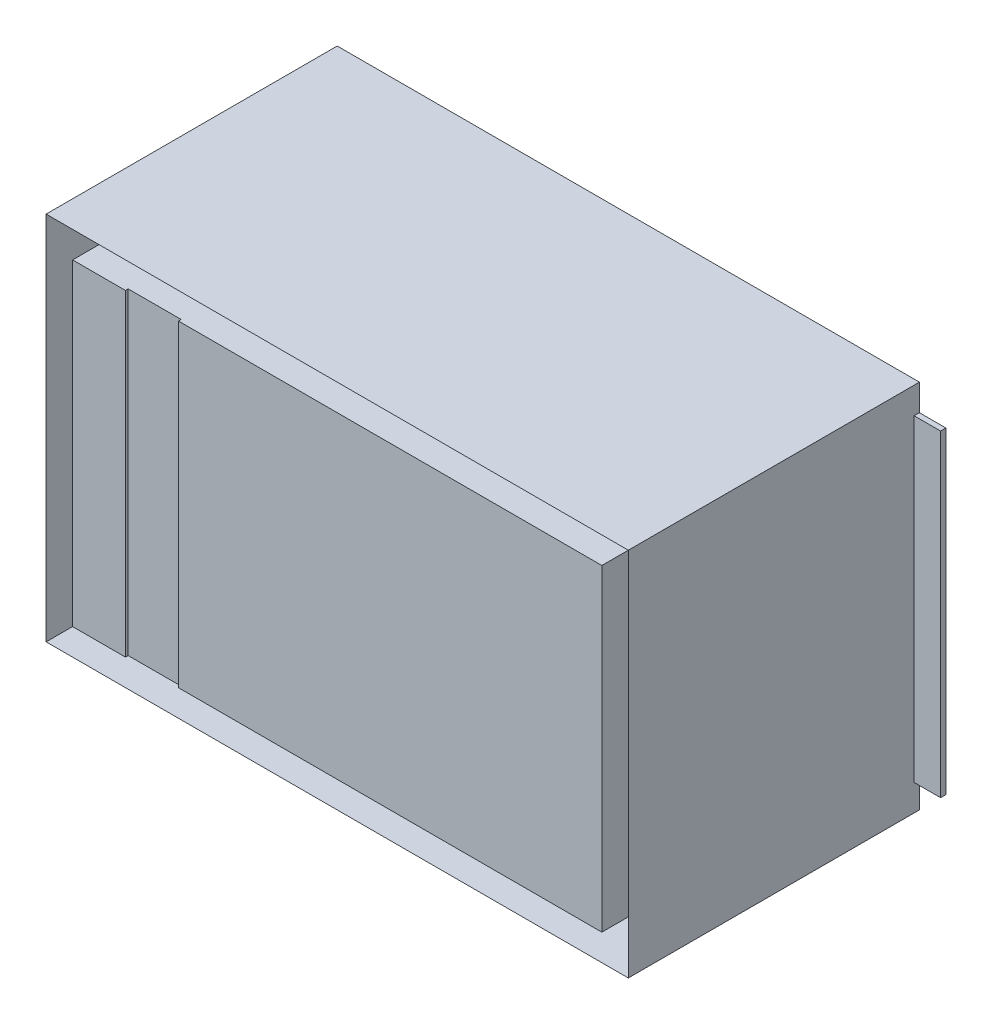
ISO-10303-21;
HEADER;
FILE_DESCRIPTION(('STEP AP214'),'2;1');
FILE_NAME('part.step','',(''),(''),'','','');
FILE_SCHEMA(('AUTOMOTIVE_DESIGN { 1 0 10303 214 1 1 1 1 }'));
ENDSEC;
DATA;
#1=APPLICATION_CONTEXT('core data for automotive mechanical design processes');
#2=APPLICATION_PROTOCOL_DEFINITION('international standard','automotive_design',2000,#1);
#3=PRODUCT_CONTEXT('',#1,'mechanical');
#4=PRODUCT('Part','Part','',(#3));
#5=PRODUCT_RELATED_PRODUCT_CATEGORY('part','',(#4));
#6=PRODUCT_DEFINITION_FORMATION('','',#4);
#7=PRODUCT_DEFINITION_CONTEXT('part definition',#1,'design');
#8=PRODUCT_DEFINITION('design','',#6,#7);
#9=PRODUCT_DEFINITION_SHAPE('','',#8);
#10=(LENGTH_UNIT() NAMED_UNIT(*) SI_UNIT(.MILLI.,.METRE.));
#11=(NAMED_UNIT(*) PLANE_ANGLE_UNIT() SI_UNIT($,.RADIAN.));
#12=(NAMED_UNIT(*) SI_UNIT($,.STERADIAN.) SOLID_ANGLE_UNIT());
#13=UNCERTAINTY_MEASURE_WITH_UNIT(LENGTH_MEASURE(1.E-05),#10,'distance_accuracy_value','');
#14=(GEOMETRIC_REPRESENTATION_CONTEXT(3) GLOBAL_UNCERTAINTY_ASSIGNED_CONTEXT((#13)) GLOBAL_UNIT_ASSIGNED_CONTEXT((#10,
#11,#12)) REPRESENTATION_CONTEXT('',''));
#15=CARTESIAN_POINT('',(0.,0.,0.));
#16=DIRECTION('',(0.,0.,1.));
#17=DIRECTION('',(1.,0.,0.));
#18=AXIS2_PLACEMENT_3D('',#15,#16,#17);
#19=CARTESIAN_POINT('',(0.5,-0.3,0.0762));
#20=DIRECTION('',(1.,0.,0.));
#21=DIRECTION('',(0.,1.,0.));
#22=AXIS2_PLACEMENT_3D('',#19,#20,#21);
#23=PLANE('',#22);
#24=DIRECTION('',(0.,0.,1.));
#25=VECTOR('',#24,1.);
#26=CARTESIAN_POINT('',(0.5,0.3,0.1262));
#27=LINE('',#26,#25);
#28=CARTESIAN_POINT('',(0.5,0.3,0.1262));
#29=VERTEX_POINT('',#28);
#30=CARTESIAN_POINT('',(0.5,0.3,0.6262));
#31=VERTEX_POINT('',#30);
#32=EDGE_CURVE('P0_E222',#29,#31,#27,.T.);
#33=ORIENTED_EDGE('',*,*,#32,.T.);
#34=DIRECTION('',(0.,1.,0.));
#35=VECTOR('',#34,1.);
#36=CARTESIAN_POINT('',(0.5,-0.3,0.6262));
#37=LINE('',#36,#35);
#38=CARTESIAN_POINT('',(0.5,-0.3,0.6262));
#39=VERTEX_POINT('',#38);
#40=EDGE_CURVE('P0_E11',#39,#31,#37,.T.);
#41=ORIENTED_EDGE('',*,*,#40,.F.);
#42=DIRECTION('',(0.,0.,1.));
#43=VECTOR('',#42,1.);
#44=CARTESIAN_POINT('',(0.5,-0.3,0.1262));
#45=LINE('',#44,#43);
#46=CARTESIAN_POINT('',(0.5,-0.3,0.1262));
#47=VERTEX_POINT('',#46);
#48=EDGE_CURVE('P0_E445',#47,#39,#45,.T.);
#49=ORIENTED_EDGE('',*,*,#48,.F.);
#50=DIRECTION('',(0.,1.,0.));
#51=VECTOR('',#50,1.);
#52=CARTESIAN_POINT('',(0.5,-0.3,0.1262));
#53=LINE('',#52,#51);
#54=EDGE_CURVE('P0_E225',#47,#29,#53,.T.);
#55=ORIENTED_EDGE('',*,*,#54,.T.);
#56=EDGE_LOOP('',(#33,#41,#49,#55));
#57=FACE_BOUND('',#56,.T.);
#58=ADVANCED_FACE('P0_F18',(#57),#23,.T.);
#59=CARTESIAN_POINT('',(-0.4,0.3,0.6262));
#60=DIRECTION('',(-1.,0.,0.));
#61=DIRECTION('',(0.,0.,1.));
#62=AXIS2_PLACEMENT_3D('',#59,#60,#61);
#63=PLANE('',#62);
#64=DIRECTION('',(0.,0.,-1.));
#65=VECTOR('',#64,1.);
#66=CARTESIAN_POINT('',(-0.4,-0.3,0.6262));
#67=LINE('',#66,#65);
#68=CARTESIAN_POINT('',(-0.4,-0.3,0.6262));
#69=VERTEX_POINT('',#68);
#70=CARTESIAN_POINT('',(-0.4,-0.3,0.6211));
#71=VERTEX_POINT('',#70);
#72=EDGE_CURVE('P0_E446',#69,#71,#67,.T.);
#73=ORIENTED_EDGE('',*,*,#72,.T.);
#74=DIRECTION('',(0.,-1.,0.));
#75=VECTOR('',#74,1.);
#76=CARTESIAN_POINT('',(-0.4,0.3,0.6211));
#77=LINE('',#76,#75);
#78=CARTESIAN_POINT('',(-0.4,0.3,0.6211));
#79=VERTEX_POINT('',#78);
#80=EDGE_CURVE('P0_E342',#79,#71,#77,.T.);
#81=ORIENTED_EDGE('',*,*,#80,.F.);
#82=DIRECTION('',(0.,0.,-1.));
#83=VECTOR('',#82,1.);
#84=CARTESIAN_POINT('',(-0.4,0.3,0.6262));
#85=LINE('',#84,#83);
#86=CARTESIAN_POINT('',(-0.4,0.3,0.6262));
#87=VERTEX_POINT('',#86);
#88=EDGE_CURVE('P0_E287',#87,#79,#85,.T.);
#89=ORIENTED_EDGE('',*,*,#88,.F.);
#90=DIRECTION('',(0.,1.,0.));
#91=VECTOR('',#90,1.);
#92=CARTESIAN_POINT('',(-0.4,-0.3,0.6262));
#93=LINE('',#92,#91);
#94=EDGE_CURVE('P0_E29',#69,#87,#93,.T.);
#95=ORIENTED_EDGE('',*,*,#94,.F.);
#96=EDGE_LOOP('',(#73,#81,#89,#95));
#97=FACE_BOUND('',#96,.T.);
#98=ADVANCED_FACE('P0_F1097',(#97),#63,.F.);
#99=CARTESIAN_POINT('',(0.,0.,0.6262));
#100=DIRECTION('',(0.,0.,1.));
#101=DIRECTION('',(1.,0.,0.));
#102=AXIS2_PLACEMENT_3D('',#99,#100,#101);
#103=PLANE('',#102);
#104=DIRECTION('',(1.,0.,0.));
#105=VECTOR('',#104,1.);
#106=CARTESIAN_POINT('',(-0.3,-0.3,0.6262));
#107=LINE('',#106,#105);
#108=CARTESIAN_POINT('',(-0.3,-0.3,0.6262));
#109=VERTEX_POINT('',#108);
#110=EDGE_CURVE('P0_E241',#109,#39,#107,.T.);
#111=ORIENTED_EDGE('',*,*,#110,.T.);
#112=ORIENTED_EDGE('',*,*,#40,.T.);
#113=DIRECTION('',(-1.,0.,0.));
#114=VECTOR('',#113,1.);
#115=CARTESIAN_POINT('',(0.5,0.3,0.6262));
#116=LINE('',#115,#114);
#117=CARTESIAN_POINT('',(-0.3,0.3,0.6262));
#118=VERTEX_POINT('',#117);
#119=EDGE_CURVE('P0_E422',#31,#118,#116,.T.);
#120=ORIENTED_EDGE('',*,*,#119,.T.);
#121=DIRECTION('',(0.,1.,0.));
#122=VECTOR('',#121,1.);
#123=CARTESIAN_POINT('',(-0.3,-0.3,0.6262));
#124=LINE('',#123,#122);
#125=EDGE_CURVE('P0_E43',#109,#118,#124,.T.);
#126=ORIENTED_EDGE('',*,*,#125,.F.);
#127=EDGE_LOOP('',(#111,#112,#120,#126));
#128=FACE_BOUND('',#127,.T.);
#129=ADVANCED_FACE('P0_F1120',(#128),#103,.T.);
#130=CARTESIAN_POINT('',(0.,0.,0.6262));
#131=DIRECTION('',(0.,0.,1.));
#132=DIRECTION('',(1.,0.,0.));
#133=AXIS2_PLACEMENT_3D('',#130,#131,#132);
#134=PLANE('',#133);
#135=DIRECTION('',(-1.,0.,0.));
#136=VECTOR('',#135,1.);
#137=CARTESIAN_POINT('',(-0.4,0.3,0.6262));
#138=LINE('',#137,#136);
#139=CARTESIAN_POINT('',(-0.5,0.3,0.6262));
#140=VERTEX_POINT('',#139);
#141=EDGE_CURVE('P0_E335',#87,#140,#138,.T.);
#142=ORIENTED_EDGE('',*,*,#141,.T.);
#143=DIRECTION('',(0.,-1.,0.));
#144=VECTOR('',#143,1.);
#145=CARTESIAN_POINT('',(-0.5,0.3,0.6262));
#146=LINE('',#145,#144);
#147=CARTESIAN_POINT('',(-0.5,-0.3,0.6262));
#148=VERTEX_POINT('',#147);
#149=EDGE_CURVE('P0_E202',#140,#148,#146,.T.);
#150=ORIENTED_EDGE('',*,*,#149,.T.);
#151=DIRECTION('',(1.,0.,0.));
#152=VECTOR('',#151,1.);
#153=CARTESIAN_POINT('',(-0.5,-0.3,0.6262));
#154=LINE('',#153,#152);
#155=EDGE_CURVE('P0_E441',#148,#69,#154,.T.);
#156=ORIENTED_EDGE('',*,*,#155,.T.);
#157=ORIENTED_EDGE('',*,*,#94,.T.);
#158=EDGE_LOOP('',(#142,#150,#156,#157));
#159=FACE_BOUND('',#158,.T.);
#160=ADVANCED_FACE('P0_F1116',(#159),#134,.T.);
#161=CARTESIAN_POINT('',(-0.3,-0.3,0.6262));
#162=DIRECTION('',(1.,0.,0.));
#163=DIRECTION('',(0.,1.,0.));
#164=AXIS2_PLACEMENT_3D('',#161,#162,#163);
#165=PLANE('',#164);
#166=DIRECTION('',(0.,0.,-1.));
#167=VECTOR('',#166,1.);
#168=CARTESIAN_POINT('',(-0.3,0.3,0.6262));
#169=LINE('',#168,#167);
#170=CARTESIAN_POINT('',(-0.3,0.3,0.6211));
#171=VERTEX_POINT('',#170);
#172=EDGE_CURVE('P0_E207',#118,#171,#169,.T.);
#173=ORIENTED_EDGE('',*,*,#172,.T.);
#174=DIRECTION('',(0.,1.,0.));
#175=VECTOR('',#174,1.);
#176=CARTESIAN_POINT('',(-0.3,-0.3,0.6211));
#177=LINE('',#176,#175);
#178=CARTESIAN_POINT('',(-0.3,-0.3,0.6211));
#179=VERTEX_POINT('',#178);
#180=EDGE_CURVE('P0_E286',#179,#171,#177,.T.);
#181=ORIENTED_EDGE('',*,*,#180,.F.);
#182=DIRECTION('',(0.,0.,-1.));
#183=VECTOR('',#182,1.);
#184=CARTESIAN_POINT('',(-0.3,-0.3,0.6262));
#185=LINE('',#184,#183);
#186=EDGE_CURVE('P0_E415',#109,#179,#185,.T.);
#187=ORIENTED_EDGE('',*,*,#186,.F.);
#188=ORIENTED_EDGE('',*,*,#125,.T.);
#189=EDGE_LOOP('',(#173,#181,#187,#188));
#190=FACE_BOUND('',#189,.T.);
#191=ADVANCED_FACE('P0_F1075',(#190),#165,.F.);
#192=CARTESIAN_POINT('',(-0.5,-0.3,0.0762));
#193=DIRECTION('',(0.,-1.,0.));
#194=DIRECTION('',(0.,0.,-1.));
#195=AXIS2_PLACEMENT_3D('',#192,#193,#194);
#196=PLANE('',#195);
#197=ORIENTED_EDGE('',*,*,#72,.F.);
#198=ORIENTED_EDGE('',*,*,#155,.F.);
#199=DIRECTION('',(0.,0.,1.));
#200=VECTOR('',#199,1.);
#201=CARTESIAN_POINT('',(-0.5,-0.3,0.1262));
#202=LINE('',#201,#200);
#203=CARTESIAN_POINT('',(-0.5,-0.3,0.1262));
#204=VERTEX_POINT('',#203);
#205=EDGE_CURVE('P0_E348',#204,#148,#202,.T.);
#206=ORIENTED_EDGE('',*,*,#205,.F.);
#207=DIRECTION('',(1.,0.,0.));
#208=VECTOR('',#207,1.);
#209=CARTESIAN_POINT('',(-0.5,-0.3,0.1262));
#210=LINE('',#209,#208);
#211=EDGE_CURVE('P0_E215',#204,#47,#210,.T.);
#212=ORIENTED_EDGE('',*,*,#211,.T.);
#213=ORIENTED_EDGE('',*,*,#48,.T.);
#214=ORIENTED_EDGE('',*,*,#110,.F.);
#215=ORIENTED_EDGE('',*,*,#186,.T.);
#216=DIRECTION('',(1.,0.,0.));
#217=VECTOR('',#216,1.);
#218=CARTESIAN_POINT('',(-0.4,-0.3,0.6211));
#219=LINE('',#218,#217);
#220=EDGE_CURVE('P0_E450',#71,#179,#219,.T.);
#221=ORIENTED_EDGE('',*,*,#220,.F.);
#222=EDGE_LOOP('',(#197,#198,#206,#212,#213,#214,#215,#221));
#223=FACE_BOUND('',#222,.T.);
#224=ADVANCED_FACE('P0_F1069',(#223),#196,.T.);
#225=CARTESIAN_POINT('',(0.,0.,0.6211));
#226=DIRECTION('',(0.,0.,1.));
#227=DIRECTION('',(1.,0.,0.));
#228=AXIS2_PLACEMENT_3D('',#225,#226,#227);
#229=PLANE('',#228);
#230=ORIENTED_EDGE('',*,*,#180,.T.);
#231=DIRECTION('',(1.,0.,0.));
#232=VECTOR('',#231,1.);
#233=CARTESIAN_POINT('',(-0.4,0.3,0.6211));
#234=LINE('',#233,#232);
#235=EDGE_CURVE('P0_E282',#79,#171,#234,.T.);
#236=ORIENTED_EDGE('',*,*,#235,.F.);
#237=ORIENTED_EDGE('',*,*,#80,.T.);
#238=ORIENTED_EDGE('',*,*,#220,.T.);
#239=EDGE_LOOP('',(#230,#236,#237,#238));
#240=FACE_BOUND('',#239,.T.);
#241=ADVANCED_FACE('P0_F1074',(#240),#229,.T.);
#242=CARTESIAN_POINT('',(0.5,0.3,0.0762));
#243=DIRECTION('',(0.,1.,0.));
#244=DIRECTION('',(1.,0.,0.));
#245=AXIS2_PLACEMENT_3D('',#242,#243,#244);
#246=PLANE('',#245);
#247=ORIENTED_EDGE('',*,*,#172,.F.);
#248=ORIENTED_EDGE('',*,*,#119,.F.);
#249=ORIENTED_EDGE('',*,*,#32,.F.);
#250=DIRECTION('',(-1.,0.,0.));
#251=VECTOR('',#250,1.);
#252=CARTESIAN_POINT('',(0.5,0.3,0.1262));
#253=LINE('',#252,#251);
#254=CARTESIAN_POINT('',(-0.5,0.3,0.1262));
#255=VERTEX_POINT('',#254);
#256=EDGE_CURVE('P0_E213',#29,#255,#253,.T.);
#257=ORIENTED_EDGE('',*,*,#256,.T.);
#258=DIRECTION('',(0.,0.,1.));
#259=VECTOR('',#258,1.);
#260=CARTESIAN_POINT('',(-0.5,0.3,0.1262));
#261=LINE('',#260,#259);
#262=EDGE_CURVE('P0_E195',#255,#140,#261,.T.);
#263=ORIENTED_EDGE('',*,*,#262,.T.);
#264=ORIENTED_EDGE('',*,*,#141,.F.);
#265=ORIENTED_EDGE('',*,*,#88,.T.);
#266=ORIENTED_EDGE('',*,*,#235,.T.);
#267=EDGE_LOOP('',(#247,#248,#249,#257,#263,#264,#265,#266));
#268=FACE_BOUND('',#267,.T.);
#269=ADVANCED_FACE('P0_F20',(#268),#246,.T.);
#270=CARTESIAN_POINT('',(-0.5,0.3,0.0762));
#271=DIRECTION('',(-1.,0.,0.));
#272=DIRECTION('',(0.,0.,1.));
#273=AXIS2_PLACEMENT_3D('',#270,#271,#272);
#274=PLANE('',#273);
#275=ORIENTED_EDGE('',*,*,#205,.T.);
#276=ORIENTED_EDGE('',*,*,#149,.F.);
#277=ORIENTED_EDGE('',*,*,#262,.F.);
#278=DIRECTION('',(0.,-1.,0.));
#279=VECTOR('',#278,1.);
#280=CARTESIAN_POINT('',(-0.5,0.3,0.1262));
#281=LINE('',#280,#279);
#282=EDGE_CURVE('P0_E199',#255,#204,#281,.T.);
#283=ORIENTED_EDGE('',*,*,#282,.T.);
#284=EDGE_LOOP('',(#275,#276,#277,#283));
#285=FACE_BOUND('',#284,.T.);
#286=ADVANCED_FACE('P0_F198',(#285),#274,.T.);
#287=CARTESIAN_POINT('',(-0.45,-0.25,0.0762));
#288=DIRECTION('',(1.,0.,0.));
#289=DIRECTION('',(0.,1.,0.));
#290=AXIS2_PLACEMENT_3D('',#287,#288,#289);
#291=PLANE('',#290);
#292=DIRECTION('',(0.,0.,1.));
#293=VECTOR('',#292,1.);
#294=CARTESIAN_POINT('',(-0.45,-0.25,0.0862));
#295=LINE('',#294,#293);
#296=CARTESIAN_POINT('',(-0.45,-0.25,0.0862));
#297=VERTEX_POINT('',#296);
#298=CARTESIAN_POINT('',(-0.45,-0.25,0.1262));
#299=VERTEX_POINT('',#298);
#300=EDGE_CURVE('P0_E346',#297,#299,#295,.T.);
#301=ORIENTED_EDGE('',*,*,#300,.T.);
#302=DIRECTION('',(0.,1.,0.));
#303=VECTOR('',#302,1.);
#304=CARTESIAN_POINT('',(-0.45,-0.25,0.1262));
#305=LINE('',#304,#303);
#306=CARTESIAN_POINT('',(-0.45,0.25,0.1262));
#307=VERTEX_POINT('',#306);
#308=EDGE_CURVE('P0_E217',#299,#307,#305,.T.);
#309=ORIENTED_EDGE('',*,*,#308,.T.);
#310=DIRECTION('',(0.,0.,1.));
#311=VECTOR('',#310,1.);
#312=CARTESIAN_POINT('',(-0.45,0.25,0.0862));
#313=LINE('',#312,#311);
#314=CARTESIAN_POINT('',(-0.45,0.25,0.0862));
#315=VERTEX_POINT('',#314);
#316=EDGE_CURVE('P0_E301',#315,#307,#313,.T.);
#317=ORIENTED_EDGE('',*,*,#316,.F.);
#318=DIRECTION('',(0.,1.,0.));
#319=VECTOR('',#318,1.);
#320=CARTESIAN_POINT('',(-0.45,-0.25,0.0862));
#321=LINE('',#320,#319);
#322=EDGE_CURVE('P0_E275',#297,#315,#321,.T.);
#323=ORIENTED_EDGE('',*,*,#322,.F.);
#324=EDGE_LOOP('',(#301,#309,#317,#323));
#325=FACE_BOUND('',#324,.T.);
#326=ADVANCED_FACE('P0_F1159',(#325),#291,.F.);
#327=CARTESIAN_POINT('',(-0.2,-0.25,0.0762));
#328=DIRECTION('',(0.,1.,0.));
#329=DIRECTION('',(1.,0.,0.));
#330=AXIS2_PLACEMENT_3D('',#327,#328,#329);
#331=PLANE('',#330);
#332=DIRECTION('',(0.,0.,1.));
#333=VECTOR('',#332,1.);
#334=CARTESIAN_POINT('',(-0.2,-0.25,0.0862));
#335=LINE('',#334,#333);
#336=CARTESIAN_POINT('',(-0.2,-0.25,0.0862));
#337=VERTEX_POINT('',#336);
#338=CARTESIAN_POINT('',(-0.2,-0.25,0.1262));
#339=VERTEX_POINT('',#338);
#340=EDGE_CURVE('P0_E349',#337,#339,#335,.T.);
#341=ORIENTED_EDGE('',*,*,#340,.T.);
#342=DIRECTION('',(-1.,0.,0.));
#343=VECTOR('',#342,1.);
#344=CARTESIAN_POINT('',(-0.2,-0.25,0.1262));
#345=LINE('',#344,#343);
#346=EDGE_CURVE('P0_E262',#339,#299,#345,.T.);
#347=ORIENTED_EDGE('',*,*,#346,.T.);
#348=ORIENTED_EDGE('',*,*,#300,.F.);
#349=DIRECTION('',(-1.,0.,0.));
#350=VECTOR('',#349,1.);
#351=CARTESIAN_POINT('',(-0.2,-0.25,0.0862));
#352=LINE('',#351,#350);
#353=EDGE_CURVE('P0_E292',#337,#297,#352,.T.);
#354=ORIENTED_EDGE('',*,*,#353,.F.);
#355=EDGE_LOOP('',(#341,#347,#348,#354));
#356=FACE_BOUND('',#355,.T.);
#357=ADVANCED_FACE('P0_F510',(#356),#331,.F.);
#358=CARTESIAN_POINT('',(-0.2,0.25,0.0762));
#359=DIRECTION('',(-1.,0.,0.));
#360=DIRECTION('',(0.,0.,1.));
#361=AXIS2_PLACEMENT_3D('',#358,#359,#360);
#362=PLANE('',#361);
#363=DIRECTION('',(0.,0.,1.));
#364=VECTOR('',#363,1.);
#365=CARTESIAN_POINT('',(-0.2,0.25,0.0862));
#366=LINE('',#365,#364);
#367=CARTESIAN_POINT('',(-0.2,0.25,0.0862));
#368=VERTEX_POINT('',#367);
#369=CARTESIAN_POINT('',(-0.2,0.25,0.1262));
#370=VERTEX_POINT('',#369);
#371=EDGE_CURVE('P0_E437',#368,#370,#366,.T.);
#372=ORIENTED_EDGE('',*,*,#371,.T.);
#373=DIRECTION('',(0.,-1.,0.));
#374=VECTOR('',#373,1.);
#375=CARTESIAN_POINT('',(-0.2,0.25,0.1262));
#376=LINE('',#375,#374);
#377=EDGE_CURVE('P0_E266',#370,#339,#376,.T.);
#378=ORIENTED_EDGE('',*,*,#377,.T.);
#379=ORIENTED_EDGE('',*,*,#340,.F.);
#380=DIRECTION('',(0.,-1.,0.));
#381=VECTOR('',#380,1.);
#382=CARTESIAN_POINT('',(-0.2,0.25,0.0862));
#383=LINE('',#382,#381);
#384=EDGE_CURVE('P0_E288',#368,#337,#383,.T.);
#385=ORIENTED_EDGE('',*,*,#384,.F.);
#386=EDGE_LOOP('',(#372,#378,#379,#385));
#387=FACE_BOUND('',#386,.T.);
#388=ADVANCED_FACE('P0_F497',(#387),#362,.F.);
#389=CARTESIAN_POINT('',(-0.45,0.25,0.0762));
#390=DIRECTION('',(0.,-1.,0.));
#391=DIRECTION('',(0.,0.,-1.));
#392=AXIS2_PLACEMENT_3D('',#389,#390,#391);
#393=PLANE('',#392);
#394=ORIENTED_EDGE('',*,*,#316,.T.);
#395=DIRECTION('',(1.,0.,0.));
#396=VECTOR('',#395,1.);
#397=CARTESIAN_POINT('',(-0.45,0.25,0.1262));
#398=LINE('',#397,#396);
#399=EDGE_CURVE('P0_E297',#307,#370,#398,.T.);
#400=ORIENTED_EDGE('',*,*,#399,.T.);
#401=ORIENTED_EDGE('',*,*,#371,.F.);
#402=DIRECTION('',(1.,0.,0.));
#403=VECTOR('',#402,1.);
#404=CARTESIAN_POINT('',(-0.45,0.25,0.0862));
#405=LINE('',#404,#403);
#406=EDGE_CURVE('P0_E271',#315,#368,#405,.T.);
#407=ORIENTED_EDGE('',*,*,#406,.F.);
#408=EDGE_LOOP('',(#394,#400,#401,#407));
#409=FACE_BOUND('',#408,.T.);
#410=ADVANCED_FACE('P0_F505',(#409),#393,.F.);
#411=CARTESIAN_POINT('',(0.,0.,0.1262));
#412=DIRECTION('',(0.,0.,1.));
#413=DIRECTION('',(1.,0.,0.));
#414=AXIS2_PLACEMENT_3D('',#411,#412,#413);
#415=PLANE('',#414);
#416=DIRECTION('',(0.,1.,0.));
#417=VECTOR('',#416,1.);
#418=CARTESIAN_POINT('',(0.05,-0.25,0.1262));
#419=LINE('',#418,#417);
#420=CARTESIAN_POINT('',(0.05,-0.25,0.1262));
#421=VERTEX_POINT('',#420);
#422=CARTESIAN_POINT('',(0.05,0.25,0.1262));
#423=VERTEX_POINT('',#422);
#424=EDGE_CURVE('P0_E226',#421,#423,#419,.T.);
#425=ORIENTED_EDGE('',*,*,#424,.F.);
#426=DIRECTION('',(-1.,0.,0.));
#427=VECTOR('',#426,1.);
#428=CARTESIAN_POINT('',(0.45,-0.25,0.1262));
#429=LINE('',#428,#427);
#430=CARTESIAN_POINT('',(0.45,-0.25,0.1262));
#431=VERTEX_POINT('',#430);
#432=EDGE_CURVE('P0_E314',#431,#421,#429,.T.);
#433=ORIENTED_EDGE('',*,*,#432,.F.);
#434=DIRECTION('',(0.,-1.,0.));
#435=VECTOR('',#434,1.);
#436=CARTESIAN_POINT('',(0.45,0.25,0.1262));
#437=LINE('',#436,#435);
#438=CARTESIAN_POINT('',(0.45,0.25,0.1262));
#439=VERTEX_POINT('',#438);
#440=EDGE_CURVE('P0_E331',#439,#431,#437,.T.);
#441=ORIENTED_EDGE('',*,*,#440,.F.);
#442=DIRECTION('',(1.,0.,0.));
#443=VECTOR('',#442,1.);
#444=CARTESIAN_POINT('',(0.05,0.25,0.1262));
#445=LINE('',#444,#443);
#446=EDGE_CURVE('P0_E22',#423,#439,#445,.T.);
#447=ORIENTED_EDGE('',*,*,#446,.F.);
#448=EDGE_LOOP('',(#425,#433,#441,#447));
#449=FACE_BOUND('',#448,.T.);
#450=ORIENTED_EDGE('',*,*,#308,.F.);
#451=ORIENTED_EDGE('',*,*,#346,.F.);
#452=ORIENTED_EDGE('',*,*,#377,.F.);
#453=ORIENTED_EDGE('',*,*,#399,.F.);
#454=EDGE_LOOP('',(#450,#451,#452,#453));
#455=FACE_BOUND('',#454,.T.);
#456=ORIENTED_EDGE('',*,*,#256,.F.);
#457=ORIENTED_EDGE('',*,*,#54,.F.);
#458=ORIENTED_EDGE('',*,*,#211,.F.);
#459=ORIENTED_EDGE('',*,*,#282,.F.);
#460=EDGE_LOOP('',(#456,#457,#458,#459));
#461=FACE_BOUND('',#460,.T.);
#462=ADVANCED_FACE('P0_F211',(#449,#455,#461),#415,.F.);
#463=CARTESIAN_POINT('',(0.05,-0.25,0.0762));
#464=DIRECTION('',(1.,0.,0.));
#465=DIRECTION('',(0.,1.,0.));
#466=AXIS2_PLACEMENT_3D('',#463,#464,#465);
#467=PLANE('',#466);
#468=DIRECTION('',(0.,0.,1.));
#469=VECTOR('',#468,1.);
#470=CARTESIAN_POINT('',(0.05,-0.25,0.0862));
#471=LINE('',#470,#469);
#472=CARTESIAN_POINT('',(0.05,-0.25,0.0862));
#473=VERTEX_POINT('',#472);
#474=EDGE_CURVE('P0_E237',#473,#421,#471,.T.);
#475=ORIENTED_EDGE('',*,*,#474,.T.);
#476=ORIENTED_EDGE('',*,*,#424,.T.);
#477=DIRECTION('',(0.,0.,1.));
#478=VECTOR('',#477,1.);
#479=CARTESIAN_POINT('',(0.05,0.25,0.0862));
#480=LINE('',#479,#478);
#481=CARTESIAN_POINT('',(0.05,0.25,0.0862));
#482=VERTEX_POINT('',#481);
#483=EDGE_CURVE('P0_E485',#482,#423,#480,.T.);
#484=ORIENTED_EDGE('',*,*,#483,.F.);
#485=DIRECTION('',(0.,1.,0.));
#486=VECTOR('',#485,1.);
#487=CARTESIAN_POINT('',(0.05,-0.25,0.0862));
#488=LINE('',#487,#486);
#489=EDGE_CURVE('P0_E429',#473,#482,#488,.T.);
#490=ORIENTED_EDGE('',*,*,#489,.F.);
#491=EDGE_LOOP('',(#475,#476,#484,#490));
#492=FACE_BOUND('',#491,.T.);
#493=ADVANCED_FACE('P0_F1167',(#492),#467,.F.);
#494=CARTESIAN_POINT('',(0.45,-0.25,0.0762));
#495=DIRECTION('',(0.,1.,0.));
#496=DIRECTION('',(1.,0.,0.));
#497=AXIS2_PLACEMENT_3D('',#494,#495,#496);
#498=PLANE('',#497);
#499=DIRECTION('',(0.,0.,1.));
#500=VECTOR('',#499,1.);
#501=CARTESIAN_POINT('',(0.45,-0.25,0.0862));
#502=LINE('',#501,#500);
#503=CARTESIAN_POINT('',(0.45,-0.25,0.0862));
#504=VERTEX_POINT('',#503);
#505=EDGE_CURVE('P0_E339',#504,#431,#502,.T.);
#506=ORIENTED_EDGE('',*,*,#505,.T.);
#507=ORIENTED_EDGE('',*,*,#432,.T.);
#508=ORIENTED_EDGE('',*,*,#474,.F.);
#509=DIRECTION('',(-1.,0.,0.));
#510=VECTOR('',#509,1.);
#511=CARTESIAN_POINT('',(0.45,-0.25,0.0862));
#512=LINE('',#511,#510);
#513=EDGE_CURVE('P0_E281',#504,#473,#512,.T.);
#514=ORIENTED_EDGE('',*,*,#513,.F.);
#515=EDGE_LOOP('',(#506,#507,#508,#514));
#516=FACE_BOUND('',#515,.T.);
#517=ADVANCED_FACE('P0_F1258',(#516),#498,.F.);
#518=CARTESIAN_POINT('',(0.45,0.25,0.0762));
#519=DIRECTION('',(-1.,0.,0.));
#520=DIRECTION('',(0.,0.,1.));
#521=AXIS2_PLACEMENT_3D('',#518,#519,#520);
#522=PLANE('',#521);
#523=DIRECTION('',(0.,0.,1.));
#524=VECTOR('',#523,1.);
#525=CARTESIAN_POINT('',(0.45,0.25,0.0862));
#526=LINE('',#525,#524);
#527=CARTESIAN_POINT('',(0.45,0.25,0.0862));
#528=VERTEX_POINT('',#527);
#529=EDGE_CURVE('P0_E327',#528,#439,#526,.T.);
#530=ORIENTED_EDGE('',*,*,#529,.T.);
#531=ORIENTED_EDGE('',*,*,#440,.T.);
#532=ORIENTED_EDGE('',*,*,#505,.F.);
#533=DIRECTION('',(0.,-1.,0.));
#534=VECTOR('',#533,1.);
#535=CARTESIAN_POINT('',(0.45,0.25,0.0862));
#536=LINE('',#535,#534);
#537=EDGE_CURVE('P0_E258',#528,#504,#536,.T.);
#538=ORIENTED_EDGE('',*,*,#537,.F.);
#539=EDGE_LOOP('',(#530,#531,#532,#538));
#540=FACE_BOUND('',#539,.T.);
#541=ADVANCED_FACE('P0_F560',(#540),#522,.F.);
#542=CARTESIAN_POINT('',(0.05,0.25,0.0762));
#543=DIRECTION('',(0.,-1.,0.));
#544=DIRECTION('',(0.,0.,-1.));
#545=AXIS2_PLACEMENT_3D('',#542,#543,#544);
#546=PLANE('',#545);
#547=ORIENTED_EDGE('',*,*,#483,.T.);
#548=ORIENTED_EDGE('',*,*,#446,.T.);
#549=ORIENTED_EDGE('',*,*,#529,.F.);
#550=DIRECTION('',(1.,0.,0.));
#551=VECTOR('',#550,1.);
#552=CARTESIAN_POINT('',(0.05,0.25,0.0862));
#553=LINE('',#552,#551);
#554=EDGE_CURVE('P0_E293',#482,#528,#553,.T.);
#555=ORIENTED_EDGE('',*,*,#554,.F.);
#556=EDGE_LOOP('',(#547,#548,#549,#555));
#557=FACE_BOUND('',#556,.T.);
#558=ADVANCED_FACE('P0_F561',(#557),#546,.F.);
#559=CARTESIAN_POINT('',(0.6,0.3,0.0762));
#560=DIRECTION('',(0.,1.,0.));
#561=DIRECTION('',(1.,0.,0.));
#562=AXIS2_PLACEMENT_3D('',#559,#560,#561);
#563=PLANE('',#562);
#564=DIRECTION('',(0.,0.,1.));
#565=VECTOR('',#564,1.);
#566=CARTESIAN_POINT('',(0.03,0.3,0.0762));
#567=LINE('',#566,#565);
#568=CARTESIAN_POINT('',(0.03,0.3,0.0762));
#569=VERTEX_POINT('',#568);
#570=CARTESIAN_POINT('',(0.03,0.3,0.0862));
#571=VERTEX_POINT('',#570);
#572=EDGE_CURVE('P0_E440',#569,#571,#567,.T.);
#573=ORIENTED_EDGE('',*,*,#572,.T.);
#574=DIRECTION('',(-1.,0.,0.));
#575=VECTOR('',#574,1.);
#576=CARTESIAN_POINT('',(0.6,0.3,0.0862));
#577=LINE('',#576,#575);
#578=CARTESIAN_POINT('',(0.6,0.3,0.0862));
#579=VERTEX_POINT('',#578);
#580=EDGE_CURVE('P0_E353',#579,#571,#577,.T.);
#581=ORIENTED_EDGE('',*,*,#580,.F.);
#582=DIRECTION('',(0.,0.,1.));
#583=VECTOR('',#582,1.);
#584=CARTESIAN_POINT('',(0.6,0.3,0.0762));
#585=LINE('',#584,#583);
#586=CARTESIAN_POINT('',(0.6,0.3,0.0762));
#587=VERTEX_POINT('',#586);
#588=EDGE_CURVE('P0_E270',#587,#579,#585,.T.);
#589=ORIENTED_EDGE('',*,*,#588,.F.);
#590=DIRECTION('',(-1.,0.,0.));
#591=VECTOR('',#590,1.);
#592=CARTESIAN_POINT('',(0.6,0.3,0.0762));
#593=LINE('',#592,#591);
#594=EDGE_CURVE('P0_E248',#587,#569,#593,.T.);
#595=ORIENTED_EDGE('',*,*,#594,.T.);
#596=EDGE_LOOP('',(#573,#581,#589,#595));
#597=FACE_BOUND('',#596,.T.);
#598=ADVANCED_FACE('P0_F1287',(#597),#563,.T.);
#599=CARTESIAN_POINT('',(0.03,0.3,0.0762));
#600=DIRECTION('',(-1.,0.,0.));
#601=DIRECTION('',(0.,0.,1.));
#602=AXIS2_PLACEMENT_3D('',#599,#600,#601);
#603=PLANE('',#602);
#604=DIRECTION('',(0.,0.,1.));
#605=VECTOR('',#604,1.);
#606=CARTESIAN_POINT('',(0.03,-0.3,0.0762));
#607=LINE('',#606,#605);
#608=CARTESIAN_POINT('',(0.03,-0.3,0.0762));
#609=VERTEX_POINT('',#608);
#610=CARTESIAN_POINT('',(0.03,-0.3,0.0862));
#611=VERTEX_POINT('',#610);
#612=EDGE_CURVE('P0_E137',#609,#611,#607,.T.);
#613=ORIENTED_EDGE('',*,*,#612,.T.);
#614=DIRECTION('',(0.,-1.,0.));
#615=VECTOR('',#614,1.);
#616=CARTESIAN_POINT('',(0.03,0.3,0.0862));
#617=LINE('',#616,#615);
#618=EDGE_CURVE('P0_E350',#571,#611,#617,.T.);
#619=ORIENTED_EDGE('',*,*,#618,.F.);
#620=ORIENTED_EDGE('',*,*,#572,.F.);
#621=DIRECTION('',(0.,-1.,0.));
#622=VECTOR('',#621,1.);
#623=CARTESIAN_POINT('',(0.03,0.3,0.0762));
#624=LINE('',#623,#622);
#625=EDGE_CURVE('P0_E252',#569,#609,#624,.T.);
#626=ORIENTED_EDGE('',*,*,#625,.T.);
#627=EDGE_LOOP('',(#613,#619,#620,#626));
#628=FACE_BOUND('',#627,.T.);
#629=ADVANCED_FACE('P0_F1297',(#628),#603,.T.);
#630=CARTESIAN_POINT('',(0.03,-0.3,0.0762));
#631=DIRECTION('',(0.,-1.,0.));
#632=DIRECTION('',(0.,0.,-1.));
#633=AXIS2_PLACEMENT_3D('',#630,#631,#632);
#634=PLANE('',#633);
#635=DIRECTION('',(0.,0.,1.));
#636=VECTOR('',#635,1.);
#637=CARTESIAN_POINT('',(0.6,-0.3,0.0762));
#638=LINE('',#637,#636);
#639=CARTESIAN_POINT('',(0.6,-0.3,0.0762));
#640=VERTEX_POINT('',#639);
#641=CARTESIAN_POINT('',(0.6,-0.3,0.0862));
#642=VERTEX_POINT('',#641);
#643=EDGE_CURVE('P0_E267',#640,#642,#638,.T.);
#644=ORIENTED_EDGE('',*,*,#643,.T.);
#645=DIRECTION('',(1.,0.,0.));
#646=VECTOR('',#645,1.);
#647=CARTESIAN_POINT('',(0.03,-0.3,0.0862));
#648=LINE('',#647,#646);
#649=EDGE_CURVE('P0_E259',#611,#642,#648,.T.);
#650=ORIENTED_EDGE('',*,*,#649,.F.);
#651=ORIENTED_EDGE('',*,*,#612,.F.);
#652=DIRECTION('',(1.,0.,0.));
#653=VECTOR('',#652,1.);
#654=CARTESIAN_POINT('',(0.03,-0.3,0.0762));
#655=LINE('',#654,#653);
#656=EDGE_CURVE('P0_E315',#609,#640,#655,.T.);
#657=ORIENTED_EDGE('',*,*,#656,.T.);
#658=EDGE_LOOP('',(#644,#650,#651,#657));
#659=FACE_BOUND('',#658,.T.);
#660=ADVANCED_FACE('P0_F1309',(#659),#634,.T.);
#661=CARTESIAN_POINT('',(0.6,-0.3,0.0762));
#662=DIRECTION('',(1.,0.,0.));
#663=DIRECTION('',(0.,1.,0.));
#664=AXIS2_PLACEMENT_3D('',#661,#662,#663);
#665=PLANE('',#664);
#666=ORIENTED_EDGE('',*,*,#588,.T.);
#667=DIRECTION('',(0.,1.,0.));
#668=VECTOR('',#667,1.);
#669=CARTESIAN_POINT('',(0.6,-0.3,0.0862));
#670=LINE('',#669,#668);
#671=EDGE_CURVE('P0_E254',#642,#579,#670,.T.);
#672=ORIENTED_EDGE('',*,*,#671,.F.);
#673=ORIENTED_EDGE('',*,*,#643,.F.);
#674=DIRECTION('',(0.,1.,0.));
#675=VECTOR('',#674,1.);
#676=CARTESIAN_POINT('',(0.6,-0.3,0.0762));
#677=LINE('',#676,#675);
#678=EDGE_CURVE('P0_E251',#640,#587,#677,.T.);
#679=ORIENTED_EDGE('',*,*,#678,.T.);
#680=EDGE_LOOP('',(#666,#672,#673,#679));
#681=FACE_BOUND('',#680,.T.);
#682=ADVANCED_FACE('P0_F1138',(#681),#665,.T.);
#683=CARTESIAN_POINT('',(0.,0.,0.0862));
#684=DIRECTION('',(0.,0.,1.));
#685=DIRECTION('',(1.,0.,0.));
#686=AXIS2_PLACEMENT_3D('',#683,#684,#685);
#687=PLANE('',#686);
#688=ORIENTED_EDGE('',*,*,#384,.T.);
#689=ORIENTED_EDGE('',*,*,#353,.T.);
#690=ORIENTED_EDGE('',*,*,#322,.T.);
#691=ORIENTED_EDGE('',*,*,#406,.T.);
#692=EDGE_LOOP('',(#688,#689,#690,#691));
#693=FACE_BOUND('',#692,.T.);
#694=DIRECTION('',(1.,0.,0.));
#695=VECTOR('',#694,1.);
#696=CARTESIAN_POINT('',(-0.6,-0.3,0.0862));
#697=LINE('',#696,#695);
#698=CARTESIAN_POINT('',(-0.6,-0.3,0.0862));
#699=VERTEX_POINT('',#698);
#700=CARTESIAN_POINT('',(-0.18,-0.3,0.0862));
#701=VERTEX_POINT('',#700);
#702=EDGE_CURVE('P0_E326',#699,#701,#697,.T.);
#703=ORIENTED_EDGE('',*,*,#702,.T.);
#704=DIRECTION('',(0.,1.,0.));
#705=VECTOR('',#704,1.);
#706=CARTESIAN_POINT('',(-0.18,-0.3,0.0862));
#707=LINE('',#706,#705);
#708=CARTESIAN_POINT('',(-0.18,0.3,0.0862));
#709=VERTEX_POINT('',#708);
#710=EDGE_CURVE('P0_E246',#701,#709,#707,.T.);
#711=ORIENTED_EDGE('',*,*,#710,.T.);
#712=DIRECTION('',(-1.,0.,0.));
#713=VECTOR('',#712,1.);
#714=CARTESIAN_POINT('',(-0.18,0.3,0.0862));
#715=LINE('',#714,#713);
#716=CARTESIAN_POINT('',(-0.6,0.3,0.0862));
#717=VERTEX_POINT('',#716);
#718=EDGE_CURVE('P0_E247',#709,#717,#715,.T.);
#719=ORIENTED_EDGE('',*,*,#718,.T.);
#720=DIRECTION('',(0.,-1.,0.));
#721=VECTOR('',#720,1.);
#722=CARTESIAN_POINT('',(-0.6,0.3,0.0862));
#723=LINE('',#722,#721);
#724=EDGE_CURVE('P0_E377',#717,#699,#723,.T.);
#725=ORIENTED_EDGE('',*,*,#724,.T.);
#726=EDGE_LOOP('',(#703,#711,#719,#725));
#727=FACE_BOUND('',#726,.T.);
#728=ADVANCED_FACE('P0_F386',(#693,#727),#687,.T.);
#729=CARTESIAN_POINT('',(0.,0.,0.0862));
#730=DIRECTION('',(0.,0.,1.));
#731=DIRECTION('',(1.,0.,0.));
#732=AXIS2_PLACEMENT_3D('',#729,#730,#731);
#733=PLANE('',#732);
#734=ORIENTED_EDGE('',*,*,#537,.T.);
#735=ORIENTED_EDGE('',*,*,#513,.T.);
#736=ORIENTED_EDGE('',*,*,#489,.T.);
#737=ORIENTED_EDGE('',*,*,#554,.T.);
#738=EDGE_LOOP('',(#734,#735,#736,#737));
#739=FACE_BOUND('',#738,.T.);
#740=ORIENTED_EDGE('',*,*,#580,.T.);
#741=ORIENTED_EDGE('',*,*,#618,.T.);
#742=ORIENTED_EDGE('',*,*,#649,.T.);
#743=ORIENTED_EDGE('',*,*,#671,.T.);
#744=EDGE_LOOP('',(#740,#741,#742,#743));
#745=FACE_BOUND('',#744,.T.);
#746=ADVANCED_FACE('P0_F1082',(#739,#745),#733,.T.);
#747=CARTESIAN_POINT('',(-0.6,-0.3,0.0762));
#748=DIRECTION('',(0.,-1.,0.));
#749=DIRECTION('',(0.,0.,-1.));
#750=AXIS2_PLACEMENT_3D('',#747,#748,#749);
#751=PLANE('',#750);
#752=DIRECTION('',(0.,0.,1.));
#753=VECTOR('',#752,1.);
#754=CARTESIAN_POINT('',(-0.18,-0.3,0.0762));
#755=LINE('',#754,#753);
#756=CARTESIAN_POINT('',(-0.18,-0.3,0.0762));
#757=VERTEX_POINT('',#756);
#758=EDGE_CURVE('P0_E322',#757,#701,#755,.T.);
#759=ORIENTED_EDGE('',*,*,#758,.T.);
#760=ORIENTED_EDGE('',*,*,#702,.F.);
#761=DIRECTION('',(0.,0.,1.));
#762=VECTOR('',#761,1.);
#763=CARTESIAN_POINT('',(-0.6,-0.3,0.0762));
#764=LINE('',#763,#762);
#765=CARTESIAN_POINT('',(-0.6,-0.3,0.0762));
#766=VERTEX_POINT('',#765);
#767=EDGE_CURVE('P0_E152',#766,#699,#764,.T.);
#768=ORIENTED_EDGE('',*,*,#767,.F.);
#769=DIRECTION('',(1.,0.,0.));
#770=VECTOR('',#769,1.);
#771=CARTESIAN_POINT('',(-0.6,-0.3,0.0762));
#772=LINE('',#771,#770);
#773=EDGE_CURVE('P0_E306',#766,#757,#772,.T.);
#774=ORIENTED_EDGE('',*,*,#773,.T.);
#775=EDGE_LOOP('',(#759,#760,#768,#774));
#776=FACE_BOUND('',#775,.T.);
#777=ADVANCED_FACE('P0_F1087',(#776),#751,.T.);
#778=CARTESIAN_POINT('',(-0.18,-0.3,0.0762));
#779=DIRECTION('',(1.,0.,0.));
#780=DIRECTION('',(0.,1.,0.));
#781=AXIS2_PLACEMENT_3D('',#778,#779,#780);
#782=PLANE('',#781);
#783=DIRECTION('',(0.,0.,1.));
#784=VECTOR('',#783,1.);
#785=CARTESIAN_POINT('',(-0.18,0.3,0.0762));
#786=LINE('',#785,#784);
#787=CARTESIAN_POINT('',(-0.18,0.3,0.0762));
#788=VERTEX_POINT('',#787);
#789=EDGE_CURVE('P0_E243',#788,#709,#786,.T.);
#790=ORIENTED_EDGE('',*,*,#789,.T.);
#791=ORIENTED_EDGE('',*,*,#710,.F.);
#792=ORIENTED_EDGE('',*,*,#758,.F.);
#793=DIRECTION('',(0.,1.,0.));
#794=VECTOR('',#793,1.);
#795=CARTESIAN_POINT('',(-0.18,-0.3,0.0762));
#796=LINE('',#795,#794);
#797=EDGE_CURVE('P0_E302',#757,#788,#796,.T.);
#798=ORIENTED_EDGE('',*,*,#797,.T.);
#799=EDGE_LOOP('',(#790,#791,#792,#798));
#800=FACE_BOUND('',#799,.T.);
#801=ADVANCED_FACE('P0_F393',(#800),#782,.T.);
#802=CARTESIAN_POINT('',(-0.18,0.3,0.0762));
#803=DIRECTION('',(0.,1.,0.));
#804=DIRECTION('',(1.,0.,0.));
#805=AXIS2_PLACEMENT_3D('',#802,#803,#804);
#806=PLANE('',#805);
#807=DIRECTION('',(0.,0.,1.));
#808=VECTOR('',#807,1.);
#809=CARTESIAN_POINT('',(-0.6,0.3,0.0762));
#810=LINE('',#809,#808);
#811=CARTESIAN_POINT('',(-0.6,0.3,0.0762));
#812=VERTEX_POINT('',#811);
#813=EDGE_CURVE('P0_E310',#812,#717,#810,.T.);
#814=ORIENTED_EDGE('',*,*,#813,.T.);
#815=ORIENTED_EDGE('',*,*,#718,.F.);
#816=ORIENTED_EDGE('',*,*,#789,.F.);
#817=DIRECTION('',(-1.,0.,0.));
#818=VECTOR('',#817,1.);
#819=CARTESIAN_POINT('',(-0.18,0.3,0.0762));
#820=LINE('',#819,#818);
#821=EDGE_CURVE('P0_E307',#788,#812,#820,.T.);
#822=ORIENTED_EDGE('',*,*,#821,.T.);
#823=EDGE_LOOP('',(#814,#815,#816,#822));
#824=FACE_BOUND('',#823,.T.);
#825=ADVANCED_FACE('P0_F397',(#824),#806,.T.);
#826=CARTESIAN_POINT('',(-0.6,0.3,0.0762));
#827=DIRECTION('',(-1.,0.,0.));
#828=DIRECTION('',(0.,0.,1.));
#829=AXIS2_PLACEMENT_3D('',#826,#827,#828);
#830=PLANE('',#829);
#831=ORIENTED_EDGE('',*,*,#767,.T.);
#832=ORIENTED_EDGE('',*,*,#724,.F.);
#833=ORIENTED_EDGE('',*,*,#813,.F.);
#834=DIRECTION('',(0.,-1.,0.));
#835=VECTOR('',#834,1.);
#836=CARTESIAN_POINT('',(-0.6,0.3,0.0762));
#837=LINE('',#836,#835);
#838=EDGE_CURVE('P0_E318',#812,#766,#837,.T.);
#839=ORIENTED_EDGE('',*,*,#838,.T.);
#840=EDGE_LOOP('',(#831,#832,#833,#839));
#841=FACE_BOUND('',#840,.T.);
#842=ADVANCED_FACE('P0_F401',(#841),#830,.T.);
#843=CARTESIAN_POINT('',(0.,0.,0.0762));
#844=DIRECTION('',(0.,0.,1.));
#845=DIRECTION('',(1.,0.,0.));
#846=AXIS2_PLACEMENT_3D('',#843,#844,#845);
#847=PLANE('',#846);
#848=ORIENTED_EDGE('',*,*,#656,.F.);
#849=ORIENTED_EDGE('',*,*,#625,.F.);
#850=ORIENTED_EDGE('',*,*,#594,.F.);
#851=ORIENTED_EDGE('',*,*,#678,.F.);
#852=EDGE_LOOP('',(#848,#849,#850,#851));
#853=FACE_BOUND('',#852,.T.);
#854=ADVANCED_FACE('P0_F1109',(#853),#847,.F.);
#855=CARTESIAN_POINT('',(0.,0.,0.0762));
#856=DIRECTION('',(0.,0.,1.));
#857=DIRECTION('',(1.,0.,0.));
#858=AXIS2_PLACEMENT_3D('',#855,#856,#857);
#859=PLANE('',#858);
#860=ORIENTED_EDGE('',*,*,#821,.F.);
#861=ORIENTED_EDGE('',*,*,#797,.F.);
#862=ORIENTED_EDGE('',*,*,#773,.F.);
#863=ORIENTED_EDGE('',*,*,#838,.F.);
#864=EDGE_LOOP('',(#860,#861,#862,#863));
#865=FACE_BOUND('',#864,.T.);
#866=ADVANCED_FACE('P0_F1104',(#865),#859,.F.);
#867=CLOSED_SHELL('',(#58,#98,#129,#160,#191,#224,#241,#269,#286,#326,#357,#388,#410,#462,#493,
#517,#541,#558,#598,#629,#660,#682,#728,#746,#777,#801,#825,#842,#854,#866));
#868=MANIFOLD_SOLID_BREP('P0_B1',#867);
#869=CARTESIAN_POINT('',(0.55,0.35,0.0762));
#870=DIRECTION('',(0.,1.,0.));
#871=DIRECTION('',(1.,0.,0.));
#872=AXIS2_PLACEMENT_3D('',#869,#870,#871);
#873=PLANE('',#872);
#874=CARTESIAN_POINT('',(0.55,0.35,0.6262));
#875=DIRECTION('',(0.,0.,-1.));
#876=VECTOR('',#875,1.);
#877=LINE('',#874,#876);
#878=CARTESIAN_POINT('',(0.55,0.35,0.6262));
#879=VERTEX_POINT('',#878);
#880=CARTESIAN_POINT('',(0.55,0.35,0.0762));
#881=VERTEX_POINT('',#880);
#882=EDGE_CURVE('P1_E29',#879,#881,#877,.T.);
#883=ORIENTED_EDGE('',*,*,#882,.T.);
#884=CARTESIAN_POINT('',(0.55,0.35,0.0762));
#885=DIRECTION('',(-1.,0.,0.));
#886=VECTOR('',#885,1.);
#887=LINE('',#884,#886);
#888=CARTESIAN_POINT('',(-0.55,0.35,0.0762));
#889=VERTEX_POINT('',#888);
#890=EDGE_CURVE('P1_E11',#881,#889,#887,.T.);
#891=ORIENTED_EDGE('',*,*,#890,.T.);
#892=CARTESIAN_POINT('',(-0.55,0.35,0.0762));
#893=DIRECTION('',(0.,0.,1.));
#894=VECTOR('',#893,1.);
#895=LINE('',#892,#894);
#896=CARTESIAN_POINT('',(-0.55,0.35,0.6262));
#897=VERTEX_POINT('',#896);
#898=EDGE_CURVE('P1_E79',#889,#897,#895,.T.);
#899=ORIENTED_EDGE('',*,*,#898,.T.);
#900=CARTESIAN_POINT('',(-0.55,0.35,0.6262));
#901=DIRECTION('',(1.,0.,0.));
#902=VECTOR('',#901,1.);
#903=LINE('',#900,#902);
#904=EDGE_CURVE('P1_E122',#897,#879,#903,.T.);
#905=ORIENTED_EDGE('',*,*,#904,.T.);
#906=EDGE_LOOP('',(#883,#891,#899,#905));
#907=FACE_BOUND('',#906,.T.);
#908=ADVANCED_FACE('P1_F18',(#907),#873,.T.);
#909=CARTESIAN_POINT('',(0.55,-0.35,0.0762));
#910=DIRECTION('',(1.,0.,0.));
#911=DIRECTION('',(0.,1.,0.));
#912=AXIS2_PLACEMENT_3D('',#909,#910,#911);
#913=PLANE('',#912);
#914=CARTESIAN_POINT('',(0.55,-0.35,0.6262));
#915=DIRECTION('',(0.,0.,-1.));
#916=VECTOR('',#915,1.);
#917=LINE('',#914,#916);
#918=CARTESIAN_POINT('',(0.55,-0.35,0.6262));
#919=VERTEX_POINT('',#918);
#920=CARTESIAN_POINT('',(0.55,-0.35,0.0762));
#921=VERTEX_POINT('',#920);
#922=EDGE_CURVE('P1_E190',#919,#921,#917,.T.);
#923=ORIENTED_EDGE('',*,*,#922,.T.);
#924=CARTESIAN_POINT('',(0.55,-0.35,0.0762));
#925=DIRECTION('',(0.,1.,0.));
#926=VECTOR('',#925,1.);
#927=LINE('',#924,#926);
#928=EDGE_CURVE('P1_E37',#921,#881,#927,.T.);
#929=ORIENTED_EDGE('',*,*,#928,.T.);
#930=ORIENTED_EDGE('',*,*,#882,.F.);
#931=CARTESIAN_POINT('',(0.55,0.35,0.6262));
#932=DIRECTION('',(0.,-1.,0.));
#933=VECTOR('',#932,1.);
#934=LINE('',#931,#933);
#935=EDGE_CURVE('P1_E82',#879,#919,#934,.T.);
#936=ORIENTED_EDGE('',*,*,#935,.T.);
#937=EDGE_LOOP('',(#923,#929,#930,#936));
#938=FACE_BOUND('',#937,.T.);
#939=ADVANCED_FACE('P1_F99',(#938),#913,.T.);
#940=CARTESIAN_POINT('',(-0.55,0.35,0.0762));
#941=DIRECTION('',(-1.,0.,0.));
#942=DIRECTION('',(0.,0.,1.));
#943=AXIS2_PLACEMENT_3D('',#940,#941,#942);
#944=PLANE('',#943);
#945=ORIENTED_EDGE('',*,*,#898,.F.);
#946=CARTESIAN_POINT('',(-0.55,0.35,0.0762));
#947=DIRECTION('',(0.,-1.,0.));
#948=VECTOR('',#947,1.);
#949=LINE('',#946,#948);
#950=CARTESIAN_POINT('',(-0.55,-0.35,0.0762));
#951=VERTEX_POINT('',#950);
#952=EDGE_CURVE('P1_E75',#889,#951,#949,.T.);
#953=ORIENTED_EDGE('',*,*,#952,.T.);
#954=CARTESIAN_POINT('',(-0.55,-0.35,0.0762));
#955=DIRECTION('',(0.,0.,1.));
#956=VECTOR('',#955,1.);
#957=LINE('',#954,#956);
#958=CARTESIAN_POINT('',(-0.55,-0.35,0.6262));
#959=VERTEX_POINT('',#958);
#960=EDGE_CURVE('P1_E61',#951,#959,#957,.T.);
#961=ORIENTED_EDGE('',*,*,#960,.T.);
#962=CARTESIAN_POINT('',(-0.55,-0.35,0.6262));
#963=DIRECTION('',(0.,1.,0.));
#964=VECTOR('',#963,1.);
#965=LINE('',#962,#964);
#966=EDGE_CURVE('P1_E70',#959,#897,#965,.T.);
#967=ORIENTED_EDGE('',*,*,#966,.T.);
#968=EDGE_LOOP('',(#945,#953,#961,#967));
#969=FACE_BOUND('',#968,.T.);
#970=ADVANCED_FACE('P1_F77',(#969),#944,.T.);
#971=CARTESIAN_POINT('',(-0.55,-0.35,0.0762));
#972=DIRECTION('',(0.,-1.,0.));
#973=DIRECTION('',(0.,0.,-1.));
#974=AXIS2_PLACEMENT_3D('',#971,#972,#973);
#975=PLANE('',#974);
#976=ORIENTED_EDGE('',*,*,#960,.F.);
#977=CARTESIAN_POINT('',(-0.55,-0.35,0.0762));
#978=DIRECTION('',(1.,0.,0.));
#979=VECTOR('',#978,1.);
#980=LINE('',#977,#979);
#981=EDGE_CURVE('P1_E64',#951,#921,#980,.T.);
#982=ORIENTED_EDGE('',*,*,#981,.T.);
#983=ORIENTED_EDGE('',*,*,#922,.F.);
#984=CARTESIAN_POINT('',(0.55,-0.35,0.6262));
#985=DIRECTION('',(-1.,0.,0.));
#986=VECTOR('',#985,1.);
#987=LINE('',#984,#986);
#988=EDGE_CURVE('P1_E58',#919,#959,#987,.T.);
#989=ORIENTED_EDGE('',*,*,#988,.T.);
#990=EDGE_LOOP('',(#976,#982,#983,#989));
#991=FACE_BOUND('',#990,.T.);
#992=ADVANCED_FACE('P1_F19',(#991),#975,.T.);
#993=OPEN_SHELL('',(#908,#939,#970,#992));
#994=SHELL_BASED_SURFACE_MODEL('P1_B1',(#993));
#995=ADVANCED_BREP_SHAPE_REPRESENTATION('',(#18,#868),#14);
#996=MANIFOLD_SURFACE_SHAPE_REPRESENTATION('',(#18,#994),#14);
#997=SHAPE_REPRESENTATION('',(#18),#14);
#998=SHAPE_DEFINITION_REPRESENTATION(#9,#997);
#999=SHAPE_REPRESENTATION_RELATIONSHIP('','',#997,#995);
#1000=SHAPE_REPRESENTATION_RELATIONSHIP('','',#997,#996);
ENDSEC;
END-ISO-10303-21;
